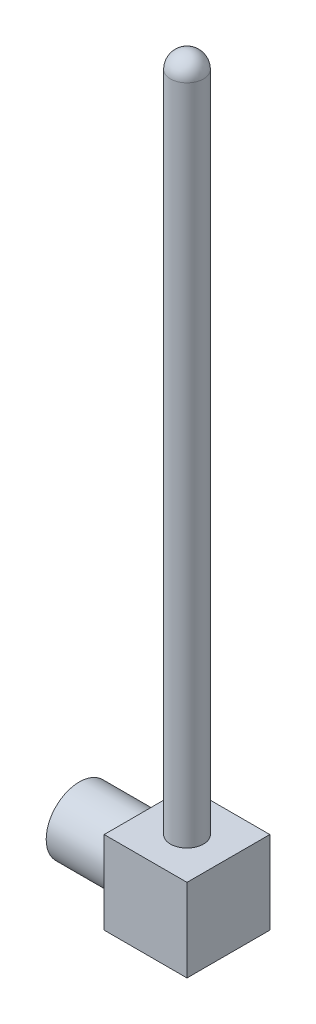
ISO-10303-21;
HEADER;
FILE_DESCRIPTION(('STEP AP214'),'2;1');
FILE_NAME('part.step','',(''),(''),'','','');
FILE_SCHEMA(('AUTOMOTIVE_DESIGN { 1 0 10303 214 1 1 1 1 }'));
ENDSEC;
DATA;
#1=APPLICATION_CONTEXT('core data for automotive mechanical design processes');
#2=APPLICATION_PROTOCOL_DEFINITION('international standard','automotive_design',2000,#1);
#3=PRODUCT_CONTEXT('',#1,'mechanical');
#4=PRODUCT('Part','Part','',(#3));
#5=PRODUCT_RELATED_PRODUCT_CATEGORY('part','',(#4));
#6=PRODUCT_DEFINITION_FORMATION('','',#4);
#7=PRODUCT_DEFINITION_CONTEXT('part definition',#1,'design');
#8=PRODUCT_DEFINITION('design','',#6,#7);
#9=PRODUCT_DEFINITION_SHAPE('','',#8);
#10=(LENGTH_UNIT() NAMED_UNIT(*) SI_UNIT(.MILLI.,.METRE.));
#11=(NAMED_UNIT(*) PLANE_ANGLE_UNIT() SI_UNIT($,.RADIAN.));
#12=(NAMED_UNIT(*) SI_UNIT($,.STERADIAN.) SOLID_ANGLE_UNIT());
#13=UNCERTAINTY_MEASURE_WITH_UNIT(LENGTH_MEASURE(1.E-05),#10,'distance_accuracy_value','');
#14=(GEOMETRIC_REPRESENTATION_CONTEXT(3) GLOBAL_UNCERTAINTY_ASSIGNED_CONTEXT((#13)) GLOBAL_UNIT_ASSIGNED_CONTEXT((#10,
#11,#12)) REPRESENTATION_CONTEXT('',''));
#15=CARTESIAN_POINT('',(0.,0.,0.));
#16=DIRECTION('',(0.,0.,1.));
#17=DIRECTION('',(1.,0.,0.));
#18=AXIS2_PLACEMENT_3D('',#15,#16,#17);
#19=CARTESIAN_POINT('',(0.,200.,0.));
#20=DIRECTION('',(0.,-1.,0.));
#21=DIRECTION('',(0.,0.,-1.));
#22=AXIS2_PLACEMENT_3D('',#19,#20,#21);
#23=CYLINDRICAL_SURFACE('',#22,5.);
#24=CARTESIAN_POINT('',(0.,200.,0.));
#25=DIRECTION('',(0.,1.,0.));
#26=DIRECTION('',(0.,0.,1.));
#27=AXIS2_PLACEMENT_3D('',#24,#25,#26);
#28=CIRCLE('',#27,5.);
#29=CARTESIAN_POINT('',(0.,200.,5.));
#30=VERTEX_POINT('',#29);
#31=EDGE_CURVE('E44',#30,#30,#28,.T.);
#32=ORIENTED_EDGE('',*,*,#31,.F.);
#33=EDGE_LOOP('',(#32));
#34=FACE_BOUND('',#33,.T.);
#35=CARTESIAN_POINT('',(0.,0.,0.));
#36=DIRECTION('',(0.,1.,0.));
#37=DIRECTION('',(0.,0.,1.));
#38=AXIS2_PLACEMENT_3D('',#35,#36,#37);
#39=CIRCLE('',#38,5.);
#40=CARTESIAN_POINT('',(0.,0.,5.));
#41=VERTEX_POINT('',#40);
#42=EDGE_CURVE('E38',#41,#41,#39,.T.);
#43=ORIENTED_EDGE('',*,*,#42,.T.);
#44=EDGE_LOOP('',(#43));
#45=FACE_BOUND('',#44,.T.);
#46=ADVANCED_FACE('F35',(#34,#45),#23,.T.);
#47=CARTESIAN_POINT('',(12.5,-25.,12.5));
#48=DIRECTION('',(-1.,0.,0.));
#49=DIRECTION('',(0.,0.,1.));
#50=AXIS2_PLACEMENT_3D('',#47,#48,#49);
#51=PLANE('',#50);
#52=DIRECTION('',(0.,0.,1.));
#53=VECTOR('',#52,1.);
#54=CARTESIAN_POINT('',(12.5,0.,12.5));
#55=LINE('',#54,#53);
#56=CARTESIAN_POINT('',(12.5,0.,-12.5));
#57=VERTEX_POINT('',#56);
#58=CARTESIAN_POINT('',(12.5,0.,12.5));
#59=VERTEX_POINT('',#58);
#60=EDGE_CURVE('E104',#57,#59,#55,.T.);
#61=ORIENTED_EDGE('',*,*,#60,.T.);
#62=DIRECTION('',(0.,1.,0.));
#63=VECTOR('',#62,1.);
#64=CARTESIAN_POINT('',(12.5,-25.,12.5));
#65=LINE('',#64,#63);
#66=CARTESIAN_POINT('',(12.5,-25.,12.5));
#67=VERTEX_POINT('',#66);
#68=EDGE_CURVE('E95',#67,#59,#65,.T.);
#69=ORIENTED_EDGE('',*,*,#68,.F.);
#70=DIRECTION('',(0.,0.,1.));
#71=VECTOR('',#70,1.);
#72=CARTESIAN_POINT('',(12.5,-25.,12.5));
#73=LINE('',#72,#71);
#74=CARTESIAN_POINT('',(12.5,-25.,-12.5));
#75=VERTEX_POINT('',#74);
#76=EDGE_CURVE('E89',#75,#67,#73,.T.);
#77=ORIENTED_EDGE('',*,*,#76,.F.);
#78=DIRECTION('',(0.,1.,0.));
#79=VECTOR('',#78,1.);
#80=CARTESIAN_POINT('',(12.5,-25.,-12.5));
#81=LINE('',#80,#79);
#82=EDGE_CURVE('E100',#75,#57,#81,.T.);
#83=ORIENTED_EDGE('',*,*,#82,.T.);
#84=EDGE_LOOP('',(#61,#69,#77,#83));
#85=FACE_BOUND('',#84,.T.);
#86=ADVANCED_FACE('F127',(#85),#51,.F.);
#87=CARTESIAN_POINT('',(-12.5,-25.,12.5));
#88=DIRECTION('',(0.,0.,-1.));
#89=DIRECTION('',(-1.,0.,0.));
#90=AXIS2_PLACEMENT_3D('',#87,#88,#89);
#91=PLANE('',#90);
#92=DIRECTION('',(-1.,0.,0.));
#93=VECTOR('',#92,1.);
#94=CARTESIAN_POINT('',(-12.5,0.,12.5));
#95=LINE('',#94,#93);
#96=CARTESIAN_POINT('',(-12.5,0.,12.5));
#97=VERTEX_POINT('',#96);
#98=EDGE_CURVE('E94',#59,#97,#95,.T.);
#99=ORIENTED_EDGE('',*,*,#98,.T.);
#100=DIRECTION('',(0.,1.,0.));
#101=VECTOR('',#100,1.);
#102=CARTESIAN_POINT('',(-12.5,-25.,12.5));
#103=LINE('',#102,#101);
#104=CARTESIAN_POINT('',(-12.5,-25.,12.5));
#105=VERTEX_POINT('',#104);
#106=EDGE_CURVE('E92',#105,#97,#103,.T.);
#107=ORIENTED_EDGE('',*,*,#106,.F.);
#108=DIRECTION('',(-1.,0.,0.));
#109=VECTOR('',#108,1.);
#110=CARTESIAN_POINT('',(-12.5,-25.,12.5));
#111=LINE('',#110,#109);
#112=EDGE_CURVE('E84',#67,#105,#111,.T.);
#113=ORIENTED_EDGE('',*,*,#112,.F.);
#114=ORIENTED_EDGE('',*,*,#68,.T.);
#115=EDGE_LOOP('',(#99,#107,#113,#114));
#116=FACE_BOUND('',#115,.T.);
#117=ADVANCED_FACE('F93',(#116),#91,.F.);
#118=CARTESIAN_POINT('',(-12.5,-25.,12.5));
#119=DIRECTION('',(1.,0.,0.));
#120=DIRECTION('',(0.,0.,-1.));
#121=AXIS2_PLACEMENT_3D('',#118,#119,#120);
#122=PLANE('',#121);
#123=CARTESIAN_POINT('',(-12.5,-12.5,0.));
#124=DIRECTION('',(-1.,0.,0.));
#125=DIRECTION('',(0.,0.,1.));
#126=AXIS2_PLACEMENT_3D('',#123,#124,#125);
#127=CIRCLE('',#126,10.);
#128=CARTESIAN_POINT('',(-12.5,-12.5,10.));
#129=VERTEX_POINT('',#128);
#130=EDGE_CURVE('E11',#129,#129,#127,.T.);
#131=ORIENTED_EDGE('',*,*,#130,.F.);
#132=EDGE_LOOP('',(#131));
#133=FACE_BOUND('',#132,.T.);
#134=DIRECTION('',(0.,0.,-1.));
#135=VECTOR('',#134,1.);
#136=CARTESIAN_POINT('',(-12.5,0.,12.5));
#137=LINE('',#136,#135);
#138=CARTESIAN_POINT('',(-12.5,0.,-12.5));
#139=VERTEX_POINT('',#138);
#140=EDGE_CURVE('E70',#97,#139,#137,.T.);
#141=ORIENTED_EDGE('',*,*,#140,.T.);
#142=DIRECTION('',(0.,1.,0.));
#143=VECTOR('',#142,1.);
#144=CARTESIAN_POINT('',(-12.5,-25.,-12.5));
#145=LINE('',#144,#143);
#146=CARTESIAN_POINT('',(-12.5,-25.,-12.5));
#147=VERTEX_POINT('',#146);
#148=EDGE_CURVE('E96',#147,#139,#145,.T.);
#149=ORIENTED_EDGE('',*,*,#148,.F.);
#150=DIRECTION('',(0.,0.,-1.));
#151=VECTOR('',#150,1.);
#152=CARTESIAN_POINT('',(-12.5,-25.,12.5));
#153=LINE('',#152,#151);
#154=EDGE_CURVE('E87',#105,#147,#153,.T.);
#155=ORIENTED_EDGE('',*,*,#154,.F.);
#156=ORIENTED_EDGE('',*,*,#106,.T.);
#157=EDGE_LOOP('',(#141,#149,#155,#156));
#158=FACE_BOUND('',#157,.T.);
#159=ADVANCED_FACE('F98',(#133,#158),#122,.F.);
#160=CARTESIAN_POINT('',(-12.5,-25.,-12.5));
#161=DIRECTION('',(0.,0.,1.));
#162=DIRECTION('',(1.,0.,0.));
#163=AXIS2_PLACEMENT_3D('',#160,#161,#162);
#164=PLANE('',#163);
#165=DIRECTION('',(1.,0.,0.));
#166=VECTOR('',#165,1.);
#167=CARTESIAN_POINT('',(-12.5,0.,-12.5));
#168=LINE('',#167,#166);
#169=EDGE_CURVE('E76',#139,#57,#168,.T.);
#170=ORIENTED_EDGE('',*,*,#169,.T.);
#171=ORIENTED_EDGE('',*,*,#82,.F.);
#172=DIRECTION('',(1.,0.,0.));
#173=VECTOR('',#172,1.);
#174=CARTESIAN_POINT('',(-12.5,-25.,-12.5));
#175=LINE('',#174,#173);
#176=EDGE_CURVE('E53',#147,#75,#175,.T.);
#177=ORIENTED_EDGE('',*,*,#176,.F.);
#178=ORIENTED_EDGE('',*,*,#148,.T.);
#179=EDGE_LOOP('',(#170,#171,#177,#178));
#180=FACE_BOUND('',#179,.T.);
#181=ADVANCED_FACE('F128',(#180),#164,.F.);
#182=CARTESIAN_POINT('',(0.,-25.,0.));
#183=DIRECTION('',(0.,-1.,0.));
#184=DIRECTION('',(0.,0.,-1.));
#185=AXIS2_PLACEMENT_3D('',#182,#183,#184);
#186=PLANE('',#185);
#187=ORIENTED_EDGE('',*,*,#76,.T.);
#188=ORIENTED_EDGE('',*,*,#112,.T.);
#189=ORIENTED_EDGE('',*,*,#154,.T.);
#190=ORIENTED_EDGE('',*,*,#176,.T.);
#191=EDGE_LOOP('',(#187,#188,#189,#190));
#192=FACE_BOUND('',#191,.T.);
#193=ADVANCED_FACE('F85',(#192),#186,.T.);
#194=CARTESIAN_POINT('',(0.,0.,0.));
#195=DIRECTION('',(0.,-1.,0.));
#196=DIRECTION('',(0.,0.,-1.));
#197=AXIS2_PLACEMENT_3D('',#194,#195,#196);
#198=PLANE('',#197);
#199=ORIENTED_EDGE('',*,*,#42,.F.);
#200=EDGE_LOOP('',(#199));
#201=FACE_BOUND('',#200,.T.);
#202=ORIENTED_EDGE('',*,*,#60,.F.);
#203=ORIENTED_EDGE('',*,*,#169,.F.);
#204=ORIENTED_EDGE('',*,*,#140,.F.);
#205=ORIENTED_EDGE('',*,*,#98,.F.);
#206=EDGE_LOOP('',(#202,#203,#204,#205));
#207=FACE_BOUND('',#206,.T.);
#208=ADVANCED_FACE('F120',(#201,#207),#198,.F.);
#209=CARTESIAN_POINT('',(-32.5,-12.5,0.));
#210=DIRECTION('',(1.,0.,0.));
#211=DIRECTION('',(0.,0.,-1.));
#212=AXIS2_PLACEMENT_3D('',#209,#210,#211);
#213=CYLINDRICAL_SURFACE('',#212,10.);
#214=CARTESIAN_POINT('',(-32.5,-12.5,0.));
#215=DIRECTION('',(-1.,0.,0.));
#216=DIRECTION('',(0.,0.,1.));
#217=AXIS2_PLACEMENT_3D('',#214,#215,#216);
#218=CIRCLE('',#217,10.);
#219=CARTESIAN_POINT('',(-32.5,-12.5,10.));
#220=VERTEX_POINT('',#219);
#221=EDGE_CURVE('E107',#220,#220,#218,.T.);
#222=ORIENTED_EDGE('',*,*,#221,.F.);
#223=EDGE_LOOP('',(#222));
#224=FACE_BOUND('',#223,.T.);
#225=ORIENTED_EDGE('',*,*,#130,.T.);
#226=EDGE_LOOP('',(#225));
#227=FACE_BOUND('',#226,.T.);
#228=ADVANCED_FACE('F123',(#224,#227),#213,.T.);
#229=CARTESIAN_POINT('',(-32.5,-12.5,0.));
#230=DIRECTION('',(-1.,0.,0.));
#231=DIRECTION('',(0.,0.,1.));
#232=AXIS2_PLACEMENT_3D('',#229,#230,#231);
#233=PLANE('',#232);
#234=ORIENTED_EDGE('',*,*,#221,.T.);
#235=EDGE_LOOP('',(#234));
#236=FACE_BOUND('',#235,.T.);
#237=ADVANCED_FACE('F167',(#236),#233,.T.);
#238=CARTESIAN_POINT('',(0.,200.,0.));
#239=DIRECTION('',(0.,0.,1.));
#240=DIRECTION('',(0.,1.,0.));
#241=AXIS2_PLACEMENT_3D('',#238,#239,#240);
#242=SPHERICAL_SURFACE('',#241,5.);
#243=CARTESIAN_POINT('',(0.,200.,0.));
#244=DIRECTION('',(0.,1.,0.));
#245=DIRECTION('',(0.,0.,1.));
#246=AXIS2_PLACEMENT_3D('',#243,#244,#245);
#247=SPHERICAL_SURFACE('',#246,5.);
#248=ORIENTED_EDGE('',*,*,#31,.T.);
#249=EDGE_LOOP('',(#248));
#250=FACE_BOUND('',#249,.T.);
#251=ADVANCED_FACE('F177',(#250),#247,.T.);
#252=CLOSED_SHELL('',(#46,#86,#117,#159,#181,#193,#208,#228,#237,#251));
#253=MANIFOLD_SOLID_BREP('B2',#252);
#254=ADVANCED_BREP_SHAPE_REPRESENTATION('',(#18,#253),#14);
#255=SHAPE_DEFINITION_REPRESENTATION(#9,#254);
ENDSEC;
END-ISO-10303-21;
